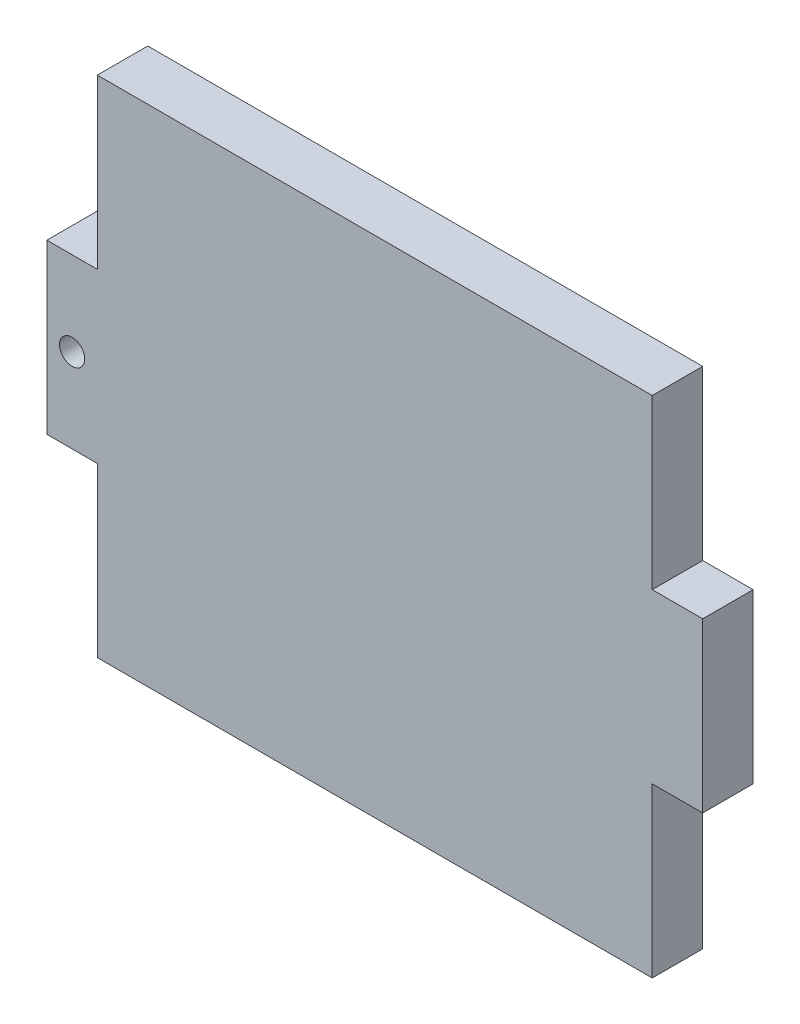
ISO-10303-21;
HEADER;
FILE_DESCRIPTION(('STEP AP214'),'2;1');
FILE_NAME('part.step','',(''),(''),'','','');
FILE_SCHEMA(('AUTOMOTIVE_DESIGN { 1 0 10303 214 1 1 1 1 }'));
ENDSEC;
DATA;
#1=APPLICATION_CONTEXT('core data for automotive mechanical design processes');
#2=APPLICATION_PROTOCOL_DEFINITION('international standard','automotive_design',2000,#1);
#3=PRODUCT_CONTEXT('',#1,'mechanical');
#4=PRODUCT('Part','Part','',(#3));
#5=PRODUCT_RELATED_PRODUCT_CATEGORY('part','',(#4));
#6=PRODUCT_DEFINITION_FORMATION('','',#4);
#7=PRODUCT_DEFINITION_CONTEXT('part definition',#1,'design');
#8=PRODUCT_DEFINITION('design','',#6,#7);
#9=PRODUCT_DEFINITION_SHAPE('','',#8);
#10=(LENGTH_UNIT() NAMED_UNIT(*) SI_UNIT(.MILLI.,.METRE.));
#11=(NAMED_UNIT(*) PLANE_ANGLE_UNIT() SI_UNIT($,.RADIAN.));
#12=(NAMED_UNIT(*) SI_UNIT($,.STERADIAN.) SOLID_ANGLE_UNIT());
#13=UNCERTAINTY_MEASURE_WITH_UNIT(LENGTH_MEASURE(1.E-05),#10,'distance_accuracy_value','');
#14=(GEOMETRIC_REPRESENTATION_CONTEXT(3) GLOBAL_UNCERTAINTY_ASSIGNED_CONTEXT((#13)) GLOBAL_UNIT_ASSIGNED_CONTEXT((#10,
#11,#12)) REPRESENTATION_CONTEXT('',''));
#15=CARTESIAN_POINT('',(0.,0.,0.));
#16=DIRECTION('',(0.,0.,1.));
#17=DIRECTION('',(1.,0.,0.));
#18=AXIS2_PLACEMENT_3D('',#15,#16,#17);
#19=CARTESIAN_POINT('',(0.,0.,6.));
#20=DIRECTION('',(0.,0.,-1.));
#21=DIRECTION('',(-1.,0.,0.));
#22=AXIS2_PLACEMENT_3D('',#19,#20,#21);
#23=PLANE('',#22);
#24=DIRECTION('',(0.,1.,0.));
#25=VECTOR('',#24,1.);
#26=CARTESIAN_POINT('',(0.,0.,6.));
#27=LINE('',#26,#25);
#28=CARTESIAN_POINT('',(0.,0.,6.));
#29=VERTEX_POINT('',#28);
#30=CARTESIAN_POINT('',(0.,20.,6.));
#31=VERTEX_POINT('',#30);
#32=EDGE_CURVE('E177',#29,#31,#27,.T.);
#33=ORIENTED_EDGE('',*,*,#32,.T.);
#34=DIRECTION('',(1.,0.,0.));
#35=VECTOR('',#34,1.);
#36=CARTESIAN_POINT('',(0.,20.,6.));
#37=LINE('',#36,#35);
#38=CARTESIAN_POINT('',(6.,20.,6.));
#39=VERTEX_POINT('',#38);
#40=EDGE_CURVE('E105',#31,#39,#37,.T.);
#41=ORIENTED_EDGE('',*,*,#40,.T.);
#42=DIRECTION('',(0.,1.,0.));
#43=VECTOR('',#42,1.);
#44=CARTESIAN_POINT('',(6.,20.,6.));
#45=LINE('',#44,#43);
#46=CARTESIAN_POINT('',(6.,40.,6.));
#47=VERTEX_POINT('',#46);
#48=EDGE_CURVE('E204',#39,#47,#45,.T.);
#49=ORIENTED_EDGE('',*,*,#48,.T.);
#50=DIRECTION('',(-1.,0.,0.));
#51=VECTOR('',#50,1.);
#52=CARTESIAN_POINT('',(0.,40.,6.));
#53=LINE('',#52,#51);
#54=CARTESIAN_POINT('',(0.,40.,6.));
#55=VERTEX_POINT('',#54);
#56=EDGE_CURVE('E223',#47,#55,#53,.T.);
#57=ORIENTED_EDGE('',*,*,#56,.T.);
#58=DIRECTION('',(0.,1.,0.));
#59=VECTOR('',#58,1.);
#60=CARTESIAN_POINT('',(0.,40.,6.));
#61=LINE('',#60,#59);
#62=CARTESIAN_POINT('',(0.,60.,6.));
#63=VERTEX_POINT('',#62);
#64=EDGE_CURVE('E220',#55,#63,#61,.T.);
#65=ORIENTED_EDGE('',*,*,#64,.T.);
#66=DIRECTION('',(-1.,0.,0.));
#67=VECTOR('',#66,1.);
#68=CARTESIAN_POINT('',(0.,60.,6.));
#69=LINE('',#68,#67);
#70=CARTESIAN_POINT('',(-66.,60.,6.));
#71=VERTEX_POINT('',#70);
#72=EDGE_CURVE('E222',#63,#71,#69,.T.);
#73=ORIENTED_EDGE('',*,*,#72,.T.);
#74=DIRECTION('',(0.,-1.,0.));
#75=VECTOR('',#74,1.);
#76=CARTESIAN_POINT('',(-66.,40.,6.));
#77=LINE('',#76,#75);
#78=CARTESIAN_POINT('',(-66.,40.,6.));
#79=VERTEX_POINT('',#78);
#80=EDGE_CURVE('E225',#71,#79,#77,.T.);
#81=ORIENTED_EDGE('',*,*,#80,.T.);
#82=DIRECTION('',(-1.,0.,0.));
#83=VECTOR('',#82,1.);
#84=CARTESIAN_POINT('',(-66.,40.,6.));
#85=LINE('',#84,#83);
#86=CARTESIAN_POINT('',(-72.,40.,6.));
#87=VERTEX_POINT('',#86);
#88=EDGE_CURVE('E231',#79,#87,#85,.T.);
#89=ORIENTED_EDGE('',*,*,#88,.T.);
#90=DIRECTION('',(0.,-1.,0.));
#91=VECTOR('',#90,1.);
#92=CARTESIAN_POINT('',(-72.,40.,6.));
#93=LINE('',#92,#91);
#94=CARTESIAN_POINT('',(-72.,20.,6.));
#95=VERTEX_POINT('',#94);
#96=EDGE_CURVE('E136',#87,#95,#93,.T.);
#97=ORIENTED_EDGE('',*,*,#96,.T.);
#98=DIRECTION('',(1.,0.,0.));
#99=VECTOR('',#98,1.);
#100=CARTESIAN_POINT('',(-66.,20.,6.));
#101=LINE('',#100,#99);
#102=CARTESIAN_POINT('',(-66.,20.,6.));
#103=VERTEX_POINT('',#102);
#104=EDGE_CURVE('E130',#95,#103,#101,.T.);
#105=ORIENTED_EDGE('',*,*,#104,.T.);
#106=DIRECTION('',(0.,-1.,0.));
#107=VECTOR('',#106,1.);
#108=CARTESIAN_POINT('',(-66.,0.,6.));
#109=LINE('',#108,#107);
#110=CARTESIAN_POINT('',(-66.,0.,6.));
#111=VERTEX_POINT('',#110);
#112=EDGE_CURVE('E134',#103,#111,#109,.T.);
#113=ORIENTED_EDGE('',*,*,#112,.T.);
#114=DIRECTION('',(1.,0.,0.));
#115=VECTOR('',#114,1.);
#116=CARTESIAN_POINT('',(0.,0.,6.));
#117=LINE('',#116,#115);
#118=EDGE_CURVE('E50',#111,#29,#117,.T.);
#119=ORIENTED_EDGE('',*,*,#118,.T.);
#120=EDGE_LOOP('',(#33,#41,#49,#57,#65,#73,#81,#89,#97,#105,#113,#119));
#121=FACE_BOUND('',#120,.T.);
#122=CARTESIAN_POINT('',(-69.,30.,6.));
#123=DIRECTION('',(0.,0.,1.));
#124=DIRECTION('',(1.,0.,0.));
#125=AXIS2_PLACEMENT_3D('',#122,#123,#124);
#126=CIRCLE('',#125,1.5);
#127=CARTESIAN_POINT('',(-67.5,30.,6.));
#128=VERTEX_POINT('',#127);
#129=EDGE_CURVE('E158',#128,#128,#126,.T.);
#130=ORIENTED_EDGE('',*,*,#129,.F.);
#131=EDGE_LOOP('',(#130));
#132=FACE_BOUND('',#131,.T.);
#133=ADVANCED_FACE('F33',(#121,#132),#23,.F.);
#134=CARTESIAN_POINT('',(0.,0.,0.));
#135=DIRECTION('',(0.,0.,-1.));
#136=DIRECTION('',(-1.,0.,0.));
#137=AXIS2_PLACEMENT_3D('',#134,#135,#136);
#138=PLANE('',#137);
#139=DIRECTION('',(0.,1.,0.));
#140=VECTOR('',#139,1.);
#141=CARTESIAN_POINT('',(0.,0.,0.));
#142=LINE('',#141,#140);
#143=CARTESIAN_POINT('',(0.,0.,0.));
#144=VERTEX_POINT('',#143);
#145=CARTESIAN_POINT('',(0.,20.,0.));
#146=VERTEX_POINT('',#145);
#147=EDGE_CURVE('E154',#144,#146,#142,.T.);
#148=ORIENTED_EDGE('',*,*,#147,.F.);
#149=DIRECTION('',(1.,0.,0.));
#150=VECTOR('',#149,1.);
#151=CARTESIAN_POINT('',(0.,0.,0.));
#152=LINE('',#151,#150);
#153=CARTESIAN_POINT('',(-66.,0.,0.));
#154=VERTEX_POINT('',#153);
#155=EDGE_CURVE('E97',#154,#144,#152,.T.);
#156=ORIENTED_EDGE('',*,*,#155,.F.);
#157=DIRECTION('',(0.,-1.,0.));
#158=VECTOR('',#157,1.);
#159=CARTESIAN_POINT('',(-66.,0.,0.));
#160=LINE('',#159,#158);
#161=CARTESIAN_POINT('',(-66.,20.,0.));
#162=VERTEX_POINT('',#161);
#163=EDGE_CURVE('E91',#162,#154,#160,.T.);
#164=ORIENTED_EDGE('',*,*,#163,.F.);
#165=DIRECTION('',(1.,0.,0.));
#166=VECTOR('',#165,1.);
#167=CARTESIAN_POINT('',(-66.,20.,0.));
#168=LINE('',#167,#166);
#169=CARTESIAN_POINT('',(-72.,20.,0.));
#170=VERTEX_POINT('',#169);
#171=EDGE_CURVE('E144',#170,#162,#168,.T.);
#172=ORIENTED_EDGE('',*,*,#171,.F.);
#173=DIRECTION('',(0.,-1.,0.));
#174=VECTOR('',#173,1.);
#175=CARTESIAN_POINT('',(-72.,40.,0.));
#176=LINE('',#175,#174);
#177=CARTESIAN_POINT('',(-72.,40.,0.));
#178=VERTEX_POINT('',#177);
#179=EDGE_CURVE('E172',#178,#170,#176,.T.);
#180=ORIENTED_EDGE('',*,*,#179,.F.);
#181=DIRECTION('',(-1.,0.,0.));
#182=VECTOR('',#181,1.);
#183=CARTESIAN_POINT('',(-66.,40.,0.));
#184=LINE('',#183,#182);
#185=CARTESIAN_POINT('',(-66.,40.,0.));
#186=VERTEX_POINT('',#185);
#187=EDGE_CURVE('E170',#186,#178,#184,.T.);
#188=ORIENTED_EDGE('',*,*,#187,.F.);
#189=DIRECTION('',(0.,-1.,0.));
#190=VECTOR('',#189,1.);
#191=CARTESIAN_POINT('',(-66.,40.,0.));
#192=LINE('',#191,#190);
#193=CARTESIAN_POINT('',(-66.,60.,0.));
#194=VERTEX_POINT('',#193);
#195=EDGE_CURVE('E168',#194,#186,#192,.T.);
#196=ORIENTED_EDGE('',*,*,#195,.F.);
#197=DIRECTION('',(-1.,0.,0.));
#198=VECTOR('',#197,1.);
#199=CARTESIAN_POINT('',(0.,60.,0.));
#200=LINE('',#199,#198);
#201=CARTESIAN_POINT('',(0.,60.,0.));
#202=VERTEX_POINT('',#201);
#203=EDGE_CURVE('E166',#202,#194,#200,.T.);
#204=ORIENTED_EDGE('',*,*,#203,.F.);
#205=DIRECTION('',(0.,1.,0.));
#206=VECTOR('',#205,1.);
#207=CARTESIAN_POINT('',(0.,40.,0.));
#208=LINE('',#207,#206);
#209=CARTESIAN_POINT('',(0.,40.,0.));
#210=VERTEX_POINT('',#209);
#211=EDGE_CURVE('E164',#210,#202,#208,.T.);
#212=ORIENTED_EDGE('',*,*,#211,.F.);
#213=DIRECTION('',(-1.,0.,0.));
#214=VECTOR('',#213,1.);
#215=CARTESIAN_POINT('',(0.,40.,0.));
#216=LINE('',#215,#214);
#217=CARTESIAN_POINT('',(6.,40.,0.));
#218=VERTEX_POINT('',#217);
#219=EDGE_CURVE('E162',#218,#210,#216,.T.);
#220=ORIENTED_EDGE('',*,*,#219,.F.);
#221=DIRECTION('',(0.,1.,0.));
#222=VECTOR('',#221,1.);
#223=CARTESIAN_POINT('',(6.,20.,0.));
#224=LINE('',#223,#222);
#225=CARTESIAN_POINT('',(6.,20.,0.));
#226=VERTEX_POINT('',#225);
#227=EDGE_CURVE('E160',#226,#218,#224,.T.);
#228=ORIENTED_EDGE('',*,*,#227,.F.);
#229=DIRECTION('',(1.,0.,0.));
#230=VECTOR('',#229,1.);
#231=CARTESIAN_POINT('',(0.,20.,0.));
#232=LINE('',#231,#230);
#233=EDGE_CURVE('E157',#146,#226,#232,.T.);
#234=ORIENTED_EDGE('',*,*,#233,.F.);
#235=EDGE_LOOP('',(#148,#156,#164,#172,#180,#188,#196,#204,#212,#220,#228,#234));
#236=FACE_BOUND('',#235,.T.);
#237=CARTESIAN_POINT('',(-69.,30.,0.));
#238=DIRECTION('',(0.,0.,1.));
#239=DIRECTION('',(1.,0.,0.));
#240=AXIS2_PLACEMENT_3D('',#237,#238,#239);
#241=CIRCLE('',#240,1.5);
#242=CARTESIAN_POINT('',(-67.5,30.,0.));
#243=VERTEX_POINT('',#242);
#244=EDGE_CURVE('E378',#243,#243,#241,.T.);
#245=ORIENTED_EDGE('',*,*,#244,.T.);
#246=EDGE_LOOP('',(#245));
#247=FACE_BOUND('',#246,.T.);
#248=ADVANCED_FACE('F208',(#236,#247),#138,.T.);
#249=CARTESIAN_POINT('',(0.,0.,6.));
#250=DIRECTION('',(-1.,0.,0.));
#251=DIRECTION('',(0.,0.,1.));
#252=AXIS2_PLACEMENT_3D('',#249,#250,#251);
#253=PLANE('',#252);
#254=ORIENTED_EDGE('',*,*,#147,.T.);
#255=DIRECTION('',(0.,0.,-1.));
#256=VECTOR('',#255,1.);
#257=CARTESIAN_POINT('',(0.,20.,6.));
#258=LINE('',#257,#256);
#259=EDGE_CURVE('E11',#31,#146,#258,.T.);
#260=ORIENTED_EDGE('',*,*,#259,.F.);
#261=ORIENTED_EDGE('',*,*,#32,.F.);
#262=DIRECTION('',(0.,0.,-1.));
#263=VECTOR('',#262,1.);
#264=CARTESIAN_POINT('',(0.,0.,6.));
#265=LINE('',#264,#263);
#266=EDGE_CURVE('E150',#29,#144,#265,.T.);
#267=ORIENTED_EDGE('',*,*,#266,.T.);
#268=EDGE_LOOP('',(#254,#260,#261,#267));
#269=FACE_BOUND('',#268,.T.);
#270=ADVANCED_FACE('F35',(#269),#253,.F.);
#271=CARTESIAN_POINT('',(0.,20.,6.));
#272=DIRECTION('',(0.,1.,0.));
#273=DIRECTION('',(0.,0.,1.));
#274=AXIS2_PLACEMENT_3D('',#271,#272,#273);
#275=PLANE('',#274);
#276=ORIENTED_EDGE('',*,*,#233,.T.);
#277=DIRECTION('',(0.,0.,-1.));
#278=VECTOR('',#277,1.);
#279=CARTESIAN_POINT('',(6.,20.,6.));
#280=LINE('',#279,#278);
#281=EDGE_CURVE('E42',#39,#226,#280,.T.);
#282=ORIENTED_EDGE('',*,*,#281,.F.);
#283=ORIENTED_EDGE('',*,*,#40,.F.);
#284=ORIENTED_EDGE('',*,*,#259,.T.);
#285=EDGE_LOOP('',(#276,#282,#283,#284));
#286=FACE_BOUND('',#285,.T.);
#287=ADVANCED_FACE('F265',(#286),#275,.F.);
#288=CARTESIAN_POINT('',(6.,20.,6.));
#289=DIRECTION('',(-1.,0.,0.));
#290=DIRECTION('',(0.,0.,1.));
#291=AXIS2_PLACEMENT_3D('',#288,#289,#290);
#292=PLANE('',#291);
#293=ORIENTED_EDGE('',*,*,#227,.T.);
#294=DIRECTION('',(0.,0.,-1.));
#295=VECTOR('',#294,1.);
#296=CARTESIAN_POINT('',(6.,40.,6.));
#297=LINE('',#296,#295);
#298=EDGE_CURVE('E196',#47,#218,#297,.T.);
#299=ORIENTED_EDGE('',*,*,#298,.F.);
#300=ORIENTED_EDGE('',*,*,#48,.F.);
#301=ORIENTED_EDGE('',*,*,#281,.T.);
#302=EDGE_LOOP('',(#293,#299,#300,#301));
#303=FACE_BOUND('',#302,.T.);
#304=ADVANCED_FACE('F202',(#303),#292,.F.);
#305=CARTESIAN_POINT('',(0.,40.,6.));
#306=DIRECTION('',(0.,-1.,0.));
#307=DIRECTION('',(0.,0.,-1.));
#308=AXIS2_PLACEMENT_3D('',#305,#306,#307);
#309=PLANE('',#308);
#310=ORIENTED_EDGE('',*,*,#219,.T.);
#311=DIRECTION('',(0.,0.,-1.));
#312=VECTOR('',#311,1.);
#313=CARTESIAN_POINT('',(0.,40.,6.));
#314=LINE('',#313,#312);
#315=EDGE_CURVE('E193',#55,#210,#314,.T.);
#316=ORIENTED_EDGE('',*,*,#315,.F.);
#317=ORIENTED_EDGE('',*,*,#56,.F.);
#318=ORIENTED_EDGE('',*,*,#298,.T.);
#319=EDGE_LOOP('',(#310,#316,#317,#318));
#320=FACE_BOUND('',#319,.T.);
#321=ADVANCED_FACE('F214',(#320),#309,.F.);
#322=CARTESIAN_POINT('',(0.,40.,6.));
#323=DIRECTION('',(-1.,0.,0.));
#324=DIRECTION('',(0.,0.,1.));
#325=AXIS2_PLACEMENT_3D('',#322,#323,#324);
#326=PLANE('',#325);
#327=ORIENTED_EDGE('',*,*,#211,.T.);
#328=DIRECTION('',(0.,0.,-1.));
#329=VECTOR('',#328,1.);
#330=CARTESIAN_POINT('',(0.,60.,6.));
#331=LINE('',#330,#329);
#332=EDGE_CURVE('E190',#63,#202,#331,.T.);
#333=ORIENTED_EDGE('',*,*,#332,.F.);
#334=ORIENTED_EDGE('',*,*,#64,.F.);
#335=ORIENTED_EDGE('',*,*,#315,.T.);
#336=EDGE_LOOP('',(#327,#333,#334,#335));
#337=FACE_BOUND('',#336,.T.);
#338=ADVANCED_FACE('F218',(#337),#326,.F.);
#339=CARTESIAN_POINT('',(0.,60.,6.));
#340=DIRECTION('',(0.,-1.,0.));
#341=DIRECTION('',(1.,0.,0.));
#342=AXIS2_PLACEMENT_3D('',#339,#340,#341);
#343=PLANE('',#342);
#344=ORIENTED_EDGE('',*,*,#203,.T.);
#345=DIRECTION('',(0.,0.,-1.));
#346=VECTOR('',#345,1.);
#347=CARTESIAN_POINT('',(-66.,60.,6.));
#348=LINE('',#347,#346);
#349=EDGE_CURVE('E187',#71,#194,#348,.T.);
#350=ORIENTED_EDGE('',*,*,#349,.F.);
#351=ORIENTED_EDGE('',*,*,#72,.F.);
#352=ORIENTED_EDGE('',*,*,#332,.T.);
#353=EDGE_LOOP('',(#344,#350,#351,#352));
#354=FACE_BOUND('',#353,.T.);
#355=ADVANCED_FACE('F278',(#354),#343,.F.);
#356=CARTESIAN_POINT('',(-66.,40.,6.));
#357=DIRECTION('',(1.,0.,0.));
#358=DIRECTION('',(0.,0.,-1.));
#359=AXIS2_PLACEMENT_3D('',#356,#357,#358);
#360=PLANE('',#359);
#361=ORIENTED_EDGE('',*,*,#195,.T.);
#362=DIRECTION('',(0.,0.,-1.));
#363=VECTOR('',#362,1.);
#364=CARTESIAN_POINT('',(-66.,40.,6.));
#365=LINE('',#364,#363);
#366=EDGE_CURVE('E184',#79,#186,#365,.T.);
#367=ORIENTED_EDGE('',*,*,#366,.F.);
#368=ORIENTED_EDGE('',*,*,#80,.F.);
#369=ORIENTED_EDGE('',*,*,#349,.T.);
#370=EDGE_LOOP('',(#361,#367,#368,#369));
#371=FACE_BOUND('',#370,.T.);
#372=ADVANCED_FACE('F281',(#371),#360,.F.);
#373=CARTESIAN_POINT('',(-66.,40.,6.));
#374=DIRECTION('',(0.,-1.,0.));
#375=DIRECTION('',(0.,0.,-1.));
#376=AXIS2_PLACEMENT_3D('',#373,#374,#375);
#377=PLANE('',#376);
#378=ORIENTED_EDGE('',*,*,#187,.T.);
#379=DIRECTION('',(0.,0.,-1.));
#380=VECTOR('',#379,1.);
#381=CARTESIAN_POINT('',(-72.,40.,6.));
#382=LINE('',#381,#380);
#383=EDGE_CURVE('E181',#87,#178,#382,.T.);
#384=ORIENTED_EDGE('',*,*,#383,.F.);
#385=ORIENTED_EDGE('',*,*,#88,.F.);
#386=ORIENTED_EDGE('',*,*,#366,.T.);
#387=EDGE_LOOP('',(#378,#384,#385,#386));
#388=FACE_BOUND('',#387,.T.);
#389=ADVANCED_FACE('F237',(#388),#377,.F.);
#390=CARTESIAN_POINT('',(-72.,40.,6.));
#391=DIRECTION('',(1.,0.,0.));
#392=DIRECTION('',(0.,0.,-1.));
#393=AXIS2_PLACEMENT_3D('',#390,#391,#392);
#394=PLANE('',#393);
#395=ORIENTED_EDGE('',*,*,#179,.T.);
#396=DIRECTION('',(0.,0.,-1.));
#397=VECTOR('',#396,1.);
#398=CARTESIAN_POINT('',(-72.,20.,6.));
#399=LINE('',#398,#397);
#400=EDGE_CURVE('E145',#95,#170,#399,.T.);
#401=ORIENTED_EDGE('',*,*,#400,.F.);
#402=ORIENTED_EDGE('',*,*,#96,.F.);
#403=ORIENTED_EDGE('',*,*,#383,.T.);
#404=EDGE_LOOP('',(#395,#401,#402,#403));
#405=FACE_BOUND('',#404,.T.);
#406=ADVANCED_FACE('F241',(#405),#394,.F.);
#407=CARTESIAN_POINT('',(-66.,20.,6.));
#408=DIRECTION('',(0.,1.,0.));
#409=DIRECTION('',(0.,0.,1.));
#410=AXIS2_PLACEMENT_3D('',#407,#408,#409);
#411=PLANE('',#410);
#412=ORIENTED_EDGE('',*,*,#171,.T.);
#413=DIRECTION('',(0.,0.,-1.));
#414=VECTOR('',#413,1.);
#415=CARTESIAN_POINT('',(-66.,20.,6.));
#416=LINE('',#415,#414);
#417=EDGE_CURVE('E141',#103,#162,#416,.T.);
#418=ORIENTED_EDGE('',*,*,#417,.F.);
#419=ORIENTED_EDGE('',*,*,#104,.F.);
#420=ORIENTED_EDGE('',*,*,#400,.T.);
#421=EDGE_LOOP('',(#412,#418,#419,#420));
#422=FACE_BOUND('',#421,.T.);
#423=ADVANCED_FACE('F142',(#422),#411,.F.);
#424=CARTESIAN_POINT('',(-66.,0.,6.));
#425=DIRECTION('',(1.,0.,0.));
#426=DIRECTION('',(0.,0.,-1.));
#427=AXIS2_PLACEMENT_3D('',#424,#425,#426);
#428=PLANE('',#427);
#429=ORIENTED_EDGE('',*,*,#163,.T.);
#430=DIRECTION('',(0.,0.,-1.));
#431=VECTOR('',#430,1.);
#432=CARTESIAN_POINT('',(-66.,0.,6.));
#433=LINE('',#432,#431);
#434=EDGE_CURVE('E146',#111,#154,#433,.T.);
#435=ORIENTED_EDGE('',*,*,#434,.F.);
#436=ORIENTED_EDGE('',*,*,#112,.F.);
#437=ORIENTED_EDGE('',*,*,#417,.T.);
#438=EDGE_LOOP('',(#429,#435,#436,#437));
#439=FACE_BOUND('',#438,.T.);
#440=ADVANCED_FACE('F148',(#439),#428,.F.);
#441=CARTESIAN_POINT('',(0.,0.,6.));
#442=DIRECTION('',(0.,1.,0.));
#443=DIRECTION('',(-1.,0.,0.));
#444=AXIS2_PLACEMENT_3D('',#441,#442,#443);
#445=PLANE('',#444);
#446=ORIENTED_EDGE('',*,*,#155,.T.);
#447=ORIENTED_EDGE('',*,*,#266,.F.);
#448=ORIENTED_EDGE('',*,*,#118,.F.);
#449=ORIENTED_EDGE('',*,*,#434,.T.);
#450=EDGE_LOOP('',(#446,#447,#448,#449));
#451=FACE_BOUND('',#450,.T.);
#452=ADVANCED_FACE('F245',(#451),#445,.F.);
#453=CARTESIAN_POINT('',(-69.,30.,6.));
#454=DIRECTION('',(0.,0.,-1.));
#455=DIRECTION('',(-1.,0.,0.));
#456=AXIS2_PLACEMENT_3D('',#453,#454,#455);
#457=CYLINDRICAL_SURFACE('',#456,1.5);
#458=ORIENTED_EDGE('',*,*,#129,.T.);
#459=EDGE_LOOP('',(#458));
#460=FACE_BOUND('',#459,.T.);
#461=ORIENTED_EDGE('',*,*,#244,.F.);
#462=EDGE_LOOP('',(#461));
#463=FACE_BOUND('',#462,.T.);
#464=ADVANCED_FACE('F247',(#460,#463),#457,.F.);
#465=CLOSED_SHELL('',(#133,#248,#270,#287,#304,#321,#338,#355,#372,#389,#406,#423,#440,#452,#464));
#466=MANIFOLD_SOLID_BREP('B2',#465);
#467=ADVANCED_BREP_SHAPE_REPRESENTATION('',(#18,#466),#14);
#468=SHAPE_DEFINITION_REPRESENTATION(#9,#467);
ENDSEC;
END-ISO-10303-21;
